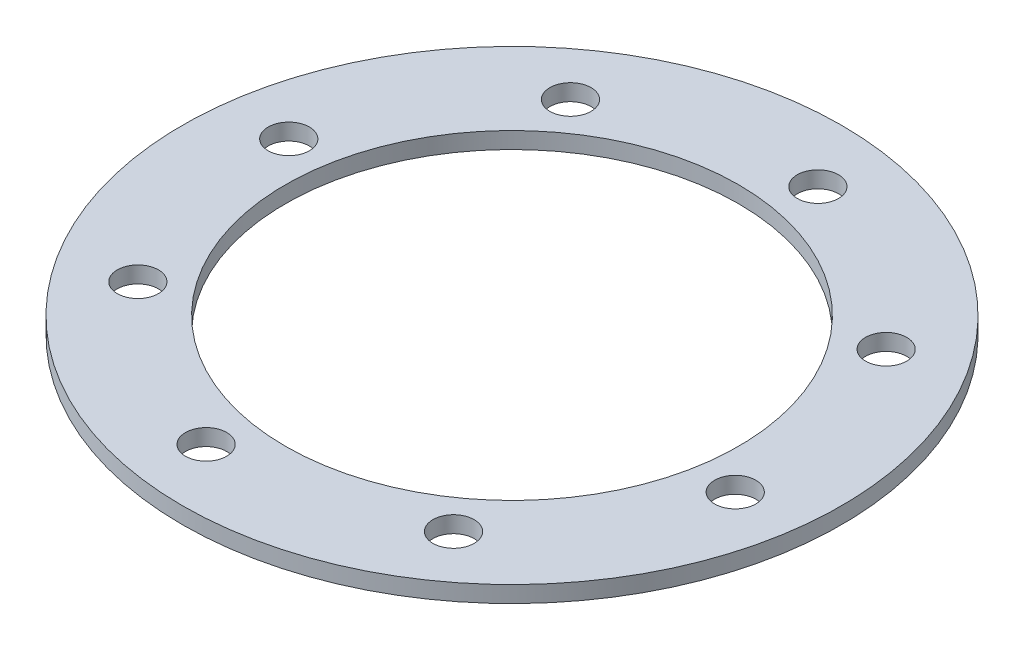
ISO-10303-21;
HEADER;
FILE_DESCRIPTION(('STEP AP214'),'2;1');
FILE_NAME('part.step','',(''),(''),'','','');
FILE_SCHEMA(('AUTOMOTIVE_DESIGN { 1 0 10303 214 1 1 1 1 }'));
ENDSEC;
DATA;
#1=APPLICATION_CONTEXT('core data for automotive mechanical design processes');
#2=APPLICATION_PROTOCOL_DEFINITION('international standard','automotive_design',2000,#1);
#3=PRODUCT_CONTEXT('',#1,'mechanical');
#4=PRODUCT('Part','Part','',(#3));
#5=PRODUCT_RELATED_PRODUCT_CATEGORY('part','',(#4));
#6=PRODUCT_DEFINITION_FORMATION('','',#4);
#7=PRODUCT_DEFINITION_CONTEXT('part definition',#1,'design');
#8=PRODUCT_DEFINITION('design','',#6,#7);
#9=PRODUCT_DEFINITION_SHAPE('','',#8);
#10=(LENGTH_UNIT() NAMED_UNIT(*) SI_UNIT(.MILLI.,.METRE.));
#11=(NAMED_UNIT(*) PLANE_ANGLE_UNIT() SI_UNIT($,.RADIAN.));
#12=(NAMED_UNIT(*) SI_UNIT($,.STERADIAN.) SOLID_ANGLE_UNIT());
#13=UNCERTAINTY_MEASURE_WITH_UNIT(LENGTH_MEASURE(1.E-05),#10,'distance_accuracy_value','');
#14=(GEOMETRIC_REPRESENTATION_CONTEXT(3) GLOBAL_UNCERTAINTY_ASSIGNED_CONTEXT((#13)) GLOBAL_UNIT_ASSIGNED_CONTEXT((#10,
#11,#12)) REPRESENTATION_CONTEXT('',''));
#15=CARTESIAN_POINT('',(0.,0.,0.));
#16=DIRECTION('',(0.,0.,1.));
#17=DIRECTION('',(1.,0.,0.));
#18=AXIS2_PLACEMENT_3D('',#15,#16,#17);
#19=CARTESIAN_POINT('',(0.,2.,0.));
#20=DIRECTION('',(0.,1.,0.));
#21=DIRECTION('',(0.,0.,1.));
#22=AXIS2_PLACEMENT_3D('',#19,#20,#21);
#23=PLANE('',#22);
#24=CARTESIAN_POINT('',(-32.1104083290435,2.,-5.01713832199981));
#25=DIRECTION('',(0.,1.,0.));
#26=DIRECTION('',(0.,0.,1.));
#27=AXIS2_PLACEMENT_3D('',#24,#25,#26);
#28=CIRCLE('',#27,2.5);
#29=CARTESIAN_POINT('',(-32.1104083290435,2.,-2.51713832199981));
#30=VERTEX_POINT('',#29);
#31=EDGE_CURVE('E55',#30,#30,#28,.T.);
#32=ORIENTED_EDGE('',*,*,#31,.F.);
#33=EDGE_LOOP('',(#32));
#34=FACE_BOUND('',#33,.T.);
#35=CARTESIAN_POINT('',(-26.2531400057726,2.,19.1578349464989));
#36=DIRECTION('',(0.,1.,0.));
#37=DIRECTION('',(0.,0.,1.));
#38=AXIS2_PLACEMENT_3D('',#35,#36,#37);
#39=CIRCLE('',#38,2.5);
#40=CARTESIAN_POINT('',(-26.2531400057726,2.,21.6578349464989));
#41=VERTEX_POINT('',#40);
#42=EDGE_CURVE('E60',#41,#41,#39,.T.);
#43=ORIENTED_EDGE('',*,*,#42,.F.);
#44=EDGE_LOOP('',(#43));
#45=FACE_BOUND('',#44,.T.);
#46=CARTESIAN_POINT('',(-5.01713832199959,2.,32.1104083290437));
#47=DIRECTION('',(0.,1.,0.));
#48=DIRECTION('',(0.,0.,1.));
#49=AXIS2_PLACEMENT_3D('',#46,#47,#48);
#50=CIRCLE('',#49,2.5);
#51=CARTESIAN_POINT('',(-5.01713832199959,2.,34.6104083290437));
#52=VERTEX_POINT('',#51);
#53=EDGE_CURVE('E63',#52,#52,#50,.T.);
#54=ORIENTED_EDGE('',*,*,#53,.F.);
#55=EDGE_LOOP('',(#54));
#56=FACE_BOUND('',#55,.T.);
#57=CARTESIAN_POINT('',(19.1578349464991,2.,26.2531400057728));
#58=DIRECTION('',(0.,1.,0.));
#59=DIRECTION('',(0.,0.,1.));
#60=AXIS2_PLACEMENT_3D('',#57,#58,#59);
#61=CIRCLE('',#60,2.5);
#62=CARTESIAN_POINT('',(19.1578349464991,2.,28.7531400057728));
#63=VERTEX_POINT('',#62);
#64=EDGE_CURVE('E66',#63,#63,#61,.T.);
#65=ORIENTED_EDGE('',*,*,#64,.F.);
#66=EDGE_LOOP('',(#65));
#67=FACE_BOUND('',#66,.T.);
#68=CARTESIAN_POINT('',(32.1104083290439,2.,5.01713832199982));
#69=DIRECTION('',(0.,1.,0.));
#70=DIRECTION('',(0.,0.,1.));
#71=AXIS2_PLACEMENT_3D('',#68,#69,#70);
#72=CIRCLE('',#71,2.5);
#73=CARTESIAN_POINT('',(32.1104083290439,2.,7.51713832199982));
#74=VERTEX_POINT('',#73);
#75=EDGE_CURVE('E69',#74,#74,#72,.T.);
#76=ORIENTED_EDGE('',*,*,#75,.F.);
#77=EDGE_LOOP('',(#76));
#78=FACE_BOUND('',#77,.T.);
#79=CARTESIAN_POINT('',(26.253140005773,2.,-19.1578349464989));
#80=DIRECTION('',(0.,1.,0.));
#81=DIRECTION('',(0.,0.,1.));
#82=AXIS2_PLACEMENT_3D('',#79,#80,#81);
#83=CIRCLE('',#82,2.5);
#84=CARTESIAN_POINT('',(26.253140005773,2.,-16.6578349464989));
#85=VERTEX_POINT('',#84);
#86=EDGE_CURVE('E72',#85,#85,#83,.T.);
#87=ORIENTED_EDGE('',*,*,#86,.F.);
#88=EDGE_LOOP('',(#87));
#89=FACE_BOUND('',#88,.T.);
#90=CARTESIAN_POINT('',(-19.1578349464986,2.,-26.2531400057728));
#91=DIRECTION('',(0.,1.,0.));
#92=DIRECTION('',(0.,0.,1.));
#93=AXIS2_PLACEMENT_3D('',#90,#91,#92);
#94=CIRCLE('',#93,2.5);
#95=CARTESIAN_POINT('',(-19.1578349464986,2.,-23.7531400057728));
#96=VERTEX_POINT('',#95);
#97=EDGE_CURVE('E75',#96,#96,#94,.T.);
#98=ORIENTED_EDGE('',*,*,#97,.F.);
#99=EDGE_LOOP('',(#98));
#100=FACE_BOUND('',#99,.T.);
#101=CARTESIAN_POINT('',(5.01713832200005,2.,-32.1104083290437));
#102=DIRECTION('',(0.,1.,0.));
#103=DIRECTION('',(0.,0.,1.));
#104=AXIS2_PLACEMENT_3D('',#101,#102,#103);
#105=CIRCLE('',#104,2.5);
#106=CARTESIAN_POINT('',(5.01713832200005,2.,-29.6104083290437));
#107=VERTEX_POINT('',#106);
#108=EDGE_CURVE('E78',#107,#107,#105,.T.);
#109=ORIENTED_EDGE('',*,*,#108,.F.);
#110=EDGE_LOOP('',(#109));
#111=FACE_BOUND('',#110,.T.);
#112=CARTESIAN_POINT('',(0.,2.,0.));
#113=DIRECTION('',(0.,1.,0.));
#114=DIRECTION('',(0.,0.,1.));
#115=AXIS2_PLACEMENT_3D('',#112,#113,#114);
#116=CIRCLE('',#115,40.);
#117=CARTESIAN_POINT('',(0.,2.,40.));
#118=VERTEX_POINT('',#117);
#119=EDGE_CURVE('E10',#118,#118,#116,.T.);
#120=ORIENTED_EDGE('',*,*,#119,.T.);
#121=EDGE_LOOP('',(#120));
#122=FACE_BOUND('',#121,.T.);
#123=CARTESIAN_POINT('',(0.,2.,0.));
#124=DIRECTION('',(0.,1.,0.));
#125=DIRECTION('',(0.,0.,1.));
#126=AXIS2_PLACEMENT_3D('',#123,#124,#125);
#127=CIRCLE('',#126,27.5);
#128=CARTESIAN_POINT('',(0.,2.,27.5));
#129=VERTEX_POINT('',#128);
#130=EDGE_CURVE('E50',#129,#129,#127,.T.);
#131=ORIENTED_EDGE('',*,*,#130,.F.);
#132=EDGE_LOOP('',(#131));
#133=FACE_BOUND('',#132,.T.);
#134=ADVANCED_FACE('F39',(#34,#45,#56,#67,#78,#89,#100,#111,#122,#133),#23,.T.);
#135=CARTESIAN_POINT('',(0.,0.,0.));
#136=DIRECTION('',(0.,1.,0.));
#137=DIRECTION('',(0.,0.,1.));
#138=AXIS2_PLACEMENT_3D('',#135,#136,#137);
#139=PLANE('',#138);
#140=CARTESIAN_POINT('',(-32.1104083290435,0.,-5.01713832199981));
#141=DIRECTION('',(0.,-1.,0.));
#142=DIRECTION('',(0.,0.,-1.));
#143=AXIS2_PLACEMENT_3D('',#140,#141,#142);
#144=CIRCLE('',#143,2.5);
#145=CARTESIAN_POINT('',(-32.1104083290435,0.,-7.51713832199981));
#146=VERTEX_POINT('',#145);
#147=EDGE_CURVE('E81',#146,#146,#144,.T.);
#148=ORIENTED_EDGE('',*,*,#147,.F.);
#149=EDGE_LOOP('',(#148));
#150=FACE_BOUND('',#149,.T.);
#151=CARTESIAN_POINT('',(-26.2531400057726,0.,19.1578349464989));
#152=DIRECTION('',(0.,-1.,0.));
#153=DIRECTION('',(0.,0.,-1.));
#154=AXIS2_PLACEMENT_3D('',#151,#152,#153);
#155=CIRCLE('',#154,2.5);
#156=CARTESIAN_POINT('',(-26.2531400057726,0.,16.6578349464989));
#157=VERTEX_POINT('',#156);
#158=EDGE_CURVE('E100',#157,#157,#155,.T.);
#159=ORIENTED_EDGE('',*,*,#158,.F.);
#160=EDGE_LOOP('',(#159));
#161=FACE_BOUND('',#160,.T.);
#162=CARTESIAN_POINT('',(-5.01713832199959,0.,32.1104083290437));
#163=DIRECTION('',(0.,-1.,0.));
#164=DIRECTION('',(0.,0.,-1.));
#165=AXIS2_PLACEMENT_3D('',#162,#163,#164);
#166=CIRCLE('',#165,2.5);
#167=CARTESIAN_POINT('',(-5.01713832199959,0.,29.6104083290437));
#168=VERTEX_POINT('',#167);
#169=EDGE_CURVE('E97',#168,#168,#166,.T.);
#170=ORIENTED_EDGE('',*,*,#169,.F.);
#171=EDGE_LOOP('',(#170));
#172=FACE_BOUND('',#171,.T.);
#173=CARTESIAN_POINT('',(19.1578349464991,0.,26.2531400057728));
#174=DIRECTION('',(0.,-1.,0.));
#175=DIRECTION('',(0.,0.,-1.));
#176=AXIS2_PLACEMENT_3D('',#173,#174,#175);
#177=CIRCLE('',#176,2.5);
#178=CARTESIAN_POINT('',(19.1578349464991,0.,23.7531400057728));
#179=VERTEX_POINT('',#178);
#180=EDGE_CURVE('E94',#179,#179,#177,.T.);
#181=ORIENTED_EDGE('',*,*,#180,.F.);
#182=EDGE_LOOP('',(#181));
#183=FACE_BOUND('',#182,.T.);
#184=CARTESIAN_POINT('',(32.1104083290439,0.,5.01713832199982));
#185=DIRECTION('',(0.,-1.,0.));
#186=DIRECTION('',(0.,0.,-1.));
#187=AXIS2_PLACEMENT_3D('',#184,#185,#186);
#188=CIRCLE('',#187,2.5);
#189=CARTESIAN_POINT('',(32.1104083290439,0.,2.51713832199982));
#190=VERTEX_POINT('',#189);
#191=EDGE_CURVE('E91',#190,#190,#188,.T.);
#192=ORIENTED_EDGE('',*,*,#191,.F.);
#193=EDGE_LOOP('',(#192));
#194=FACE_BOUND('',#193,.T.);
#195=CARTESIAN_POINT('',(26.253140005773,0.,-19.1578349464989));
#196=DIRECTION('',(0.,-1.,0.));
#197=DIRECTION('',(0.,0.,-1.));
#198=AXIS2_PLACEMENT_3D('',#195,#196,#197);
#199=CIRCLE('',#198,2.5);
#200=CARTESIAN_POINT('',(26.253140005773,0.,-21.6578349464989));
#201=VERTEX_POINT('',#200);
#202=EDGE_CURVE('E88',#201,#201,#199,.T.);
#203=ORIENTED_EDGE('',*,*,#202,.F.);
#204=EDGE_LOOP('',(#203));
#205=FACE_BOUND('',#204,.T.);
#206=CARTESIAN_POINT('',(-19.1578349464986,0.,-26.2531400057728));
#207=DIRECTION('',(0.,-1.,0.));
#208=DIRECTION('',(0.,0.,-1.));
#209=AXIS2_PLACEMENT_3D('',#206,#207,#208);
#210=CIRCLE('',#209,2.5);
#211=CARTESIAN_POINT('',(-19.1578349464986,0.,-28.7531400057728));
#212=VERTEX_POINT('',#211);
#213=EDGE_CURVE('E85',#212,#212,#210,.T.);
#214=ORIENTED_EDGE('',*,*,#213,.F.);
#215=EDGE_LOOP('',(#214));
#216=FACE_BOUND('',#215,.T.);
#217=CARTESIAN_POINT('',(5.01713832200005,0.,-32.1104083290437));
#218=DIRECTION('',(0.,-1.,0.));
#219=DIRECTION('',(0.,0.,-1.));
#220=AXIS2_PLACEMENT_3D('',#217,#218,#219);
#221=CIRCLE('',#220,2.5);
#222=CARTESIAN_POINT('',(5.01713832200005,0.,-34.6104083290437));
#223=VERTEX_POINT('',#222);
#224=EDGE_CURVE('E82',#223,#223,#221,.T.);
#225=ORIENTED_EDGE('',*,*,#224,.F.);
#226=EDGE_LOOP('',(#225));
#227=FACE_BOUND('',#226,.T.);
#228=CARTESIAN_POINT('',(0.,0.,0.));
#229=DIRECTION('',(0.,1.,0.));
#230=DIRECTION('',(0.,0.,1.));
#231=AXIS2_PLACEMENT_3D('',#228,#229,#230);
#232=CIRCLE('',#231,40.);
#233=CARTESIAN_POINT('',(0.,0.,40.));
#234=VERTEX_POINT('',#233);
#235=EDGE_CURVE('E43',#234,#234,#232,.T.);
#236=ORIENTED_EDGE('',*,*,#235,.F.);
#237=EDGE_LOOP('',(#236));
#238=FACE_BOUND('',#237,.T.);
#239=CARTESIAN_POINT('',(0.,0.,0.));
#240=DIRECTION('',(0.,1.,0.));
#241=DIRECTION('',(0.,0.,1.));
#242=AXIS2_PLACEMENT_3D('',#239,#240,#241);
#243=CIRCLE('',#242,27.5);
#244=CARTESIAN_POINT('',(0.,0.,27.5));
#245=VERTEX_POINT('',#244);
#246=EDGE_CURVE('E52',#245,#245,#243,.T.);
#247=ORIENTED_EDGE('',*,*,#246,.T.);
#248=EDGE_LOOP('',(#247));
#249=FACE_BOUND('',#248,.T.);
#250=ADVANCED_FACE('F108',(#150,#161,#172,#183,#194,#205,#216,#227,#238,#249),#139,.F.);
#251=CARTESIAN_POINT('',(0.,2.,0.));
#252=DIRECTION('',(0.,-1.,0.));
#253=DIRECTION('',(0.,0.,-1.));
#254=AXIS2_PLACEMENT_3D('',#251,#252,#253);
#255=CYLINDRICAL_SURFACE('',#254,40.);
#256=ORIENTED_EDGE('',*,*,#119,.F.);
#257=EDGE_LOOP('',(#256));
#258=FACE_BOUND('',#257,.T.);
#259=ORIENTED_EDGE('',*,*,#235,.T.);
#260=EDGE_LOOP('',(#259));
#261=FACE_BOUND('',#260,.T.);
#262=ADVANCED_FACE('F41',(#258,#261),#255,.T.);
#263=CARTESIAN_POINT('',(0.,2.,0.));
#264=DIRECTION('',(0.,-1.,0.));
#265=DIRECTION('',(0.,0.,-1.));
#266=AXIS2_PLACEMENT_3D('',#263,#264,#265);
#267=CYLINDRICAL_SURFACE('',#266,27.5);
#268=ORIENTED_EDGE('',*,*,#130,.T.);
#269=EDGE_LOOP('',(#268));
#270=FACE_BOUND('',#269,.T.);
#271=ORIENTED_EDGE('',*,*,#246,.F.);
#272=EDGE_LOOP('',(#271));
#273=FACE_BOUND('',#272,.T.);
#274=ADVANCED_FACE('F129',(#270,#273),#267,.F.);
#275=CARTESIAN_POINT('',(5.01713832200005,5.,-32.1104083290437));
#276=DIRECTION('',(0.,-1.,0.));
#277=DIRECTION('',(0.,0.,-1.));
#278=AXIS2_PLACEMENT_3D('',#275,#276,#277);
#279=CYLINDRICAL_SURFACE('',#278,2.5);
#280=ORIENTED_EDGE('',*,*,#108,.T.);
#281=EDGE_LOOP('',(#280));
#282=FACE_BOUND('',#281,.T.);
#283=ORIENTED_EDGE('',*,*,#224,.T.);
#284=EDGE_LOOP('',(#283));
#285=FACE_BOUND('',#284,.T.);
#286=ADVANCED_FACE('F131',(#282,#285),#279,.F.);
#287=CARTESIAN_POINT('',(-19.1578349464986,5.,-26.2531400057728));
#288=DIRECTION('',(0.,-1.,0.));
#289=DIRECTION('',(0.,0.,-1.));
#290=AXIS2_PLACEMENT_3D('',#287,#288,#289);
#291=CYLINDRICAL_SURFACE('',#290,2.5);
#292=ORIENTED_EDGE('',*,*,#97,.T.);
#293=EDGE_LOOP('',(#292));
#294=FACE_BOUND('',#293,.T.);
#295=ORIENTED_EDGE('',*,*,#213,.T.);
#296=EDGE_LOOP('',(#295));
#297=FACE_BOUND('',#296,.T.);
#298=ADVANCED_FACE('F139',(#294,#297),#291,.F.);
#299=CARTESIAN_POINT('',(26.253140005773,5.,-19.1578349464989));
#300=DIRECTION('',(0.,-1.,0.));
#301=DIRECTION('',(0.,0.,-1.));
#302=AXIS2_PLACEMENT_3D('',#299,#300,#301);
#303=CYLINDRICAL_SURFACE('',#302,2.5);
#304=ORIENTED_EDGE('',*,*,#86,.T.);
#305=EDGE_LOOP('',(#304));
#306=FACE_BOUND('',#305,.T.);
#307=ORIENTED_EDGE('',*,*,#202,.T.);
#308=EDGE_LOOP('',(#307));
#309=FACE_BOUND('',#308,.T.);
#310=ADVANCED_FACE('F168',(#306,#309),#303,.F.);
#311=CARTESIAN_POINT('',(32.1104083290439,5.,5.01713832199982));
#312=DIRECTION('',(0.,-1.,0.));
#313=DIRECTION('',(0.,0.,-1.));
#314=AXIS2_PLACEMENT_3D('',#311,#312,#313);
#315=CYLINDRICAL_SURFACE('',#314,2.5);
#316=ORIENTED_EDGE('',*,*,#75,.T.);
#317=EDGE_LOOP('',(#316));
#318=FACE_BOUND('',#317,.T.);
#319=ORIENTED_EDGE('',*,*,#191,.T.);
#320=EDGE_LOOP('',(#319));
#321=FACE_BOUND('',#320,.T.);
#322=ADVANCED_FACE('F173',(#318,#321),#315,.F.);
#323=CARTESIAN_POINT('',(19.1578349464991,5.,26.2531400057728));
#324=DIRECTION('',(0.,-1.,0.));
#325=DIRECTION('',(0.,0.,-1.));
#326=AXIS2_PLACEMENT_3D('',#323,#324,#325);
#327=CYLINDRICAL_SURFACE('',#326,2.5);
#328=ORIENTED_EDGE('',*,*,#64,.T.);
#329=EDGE_LOOP('',(#328));
#330=FACE_BOUND('',#329,.T.);
#331=ORIENTED_EDGE('',*,*,#180,.T.);
#332=EDGE_LOOP('',(#331));
#333=FACE_BOUND('',#332,.T.);
#334=ADVANCED_FACE('F179',(#330,#333),#327,.F.);
#335=CARTESIAN_POINT('',(-5.01713832199959,5.,32.1104083290437));
#336=DIRECTION('',(0.,-1.,0.));
#337=DIRECTION('',(0.,0.,-1.));
#338=AXIS2_PLACEMENT_3D('',#335,#336,#337);
#339=CYLINDRICAL_SURFACE('',#338,2.5);
#340=ORIENTED_EDGE('',*,*,#53,.T.);
#341=EDGE_LOOP('',(#340));
#342=FACE_BOUND('',#341,.T.);
#343=ORIENTED_EDGE('',*,*,#169,.T.);
#344=EDGE_LOOP('',(#343));
#345=FACE_BOUND('',#344,.T.);
#346=ADVANCED_FACE('F183',(#342,#345),#339,.F.);
#347=CARTESIAN_POINT('',(-26.2531400057726,5.,19.1578349464989));
#348=DIRECTION('',(0.,-1.,0.));
#349=DIRECTION('',(0.,0.,-1.));
#350=AXIS2_PLACEMENT_3D('',#347,#348,#349);
#351=CYLINDRICAL_SURFACE('',#350,2.5);
#352=ORIENTED_EDGE('',*,*,#42,.T.);
#353=EDGE_LOOP('',(#352));
#354=FACE_BOUND('',#353,.T.);
#355=ORIENTED_EDGE('',*,*,#158,.T.);
#356=EDGE_LOOP('',(#355));
#357=FACE_BOUND('',#356,.T.);
#358=ADVANCED_FACE('F187',(#354,#357),#351,.F.);
#359=CARTESIAN_POINT('',(-32.1104083290435,5.,-5.01713832199981));
#360=DIRECTION('',(0.,-1.,0.));
#361=DIRECTION('',(0.,0.,-1.));
#362=AXIS2_PLACEMENT_3D('',#359,#360,#361);
#363=CYLINDRICAL_SURFACE('',#362,2.5);
#364=ORIENTED_EDGE('',*,*,#31,.T.);
#365=EDGE_LOOP('',(#364));
#366=FACE_BOUND('',#365,.T.);
#367=ORIENTED_EDGE('',*,*,#147,.T.);
#368=EDGE_LOOP('',(#367));
#369=FACE_BOUND('',#368,.T.);
#370=ADVANCED_FACE('F106',(#366,#369),#363,.F.);
#371=CLOSED_SHELL('',(#134,#250,#262,#274,#286,#298,#310,#322,#334,#346,#358,#370));
#372=MANIFOLD_SOLID_BREP('B2',#371);
#373=ADVANCED_BREP_SHAPE_REPRESENTATION('',(#18,#372),#14);
#374=SHAPE_DEFINITION_REPRESENTATION(#9,#373);
ENDSEC;
END-ISO-10303-21;
